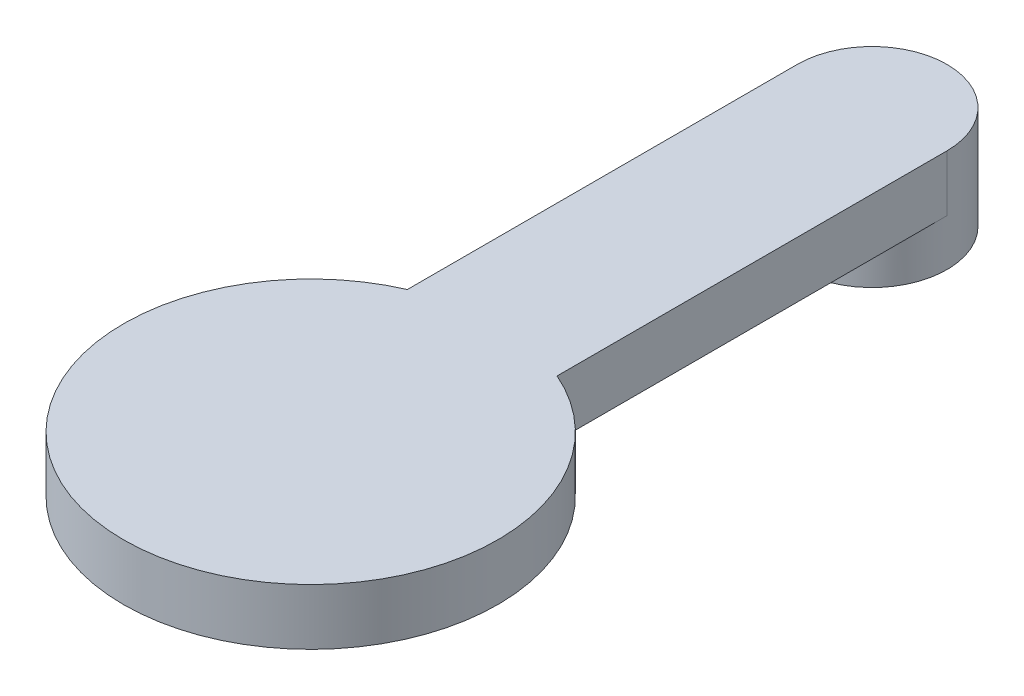
ISO-10303-21;
HEADER;
FILE_DESCRIPTION(('STEP AP214'),'2;1');
FILE_NAME('part.step','',(''),(''),'','','');
FILE_SCHEMA(('AUTOMOTIVE_DESIGN { 1 0 10303 214 1 1 1 1 }'));
ENDSEC;
DATA;
#1=APPLICATION_CONTEXT('core data for automotive mechanical design processes');
#2=APPLICATION_PROTOCOL_DEFINITION('international standard','automotive_design',2000,#1);
#3=PRODUCT_CONTEXT('',#1,'mechanical');
#4=PRODUCT('Part','Part','',(#3));
#5=PRODUCT_RELATED_PRODUCT_CATEGORY('part','',(#4));
#6=PRODUCT_DEFINITION_FORMATION('','',#4);
#7=PRODUCT_DEFINITION_CONTEXT('part definition',#1,'design');
#8=PRODUCT_DEFINITION('design','',#6,#7);
#9=PRODUCT_DEFINITION_SHAPE('','',#8);
#10=(LENGTH_UNIT() NAMED_UNIT(*) SI_UNIT(.MILLI.,.METRE.));
#11=(NAMED_UNIT(*) PLANE_ANGLE_UNIT() SI_UNIT($,.RADIAN.));
#12=(NAMED_UNIT(*) SI_UNIT($,.STERADIAN.) SOLID_ANGLE_UNIT());
#13=UNCERTAINTY_MEASURE_WITH_UNIT(LENGTH_MEASURE(1.E-05),#10,'distance_accuracy_value','');
#14=(GEOMETRIC_REPRESENTATION_CONTEXT(3) GLOBAL_UNCERTAINTY_ASSIGNED_CONTEXT((#13)) GLOBAL_UNIT_ASSIGNED_CONTEXT((#10,
#11,#12)) REPRESENTATION_CONTEXT('',''));
#15=CARTESIAN_POINT('',(0.,0.,0.));
#16=DIRECTION('',(0.,0.,1.));
#17=DIRECTION('',(1.,0.,0.));
#18=AXIS2_PLACEMENT_3D('',#15,#16,#17);
#19=CARTESIAN_POINT('',(0.,0.,0.));
#20=DIRECTION('',(0.,1.,0.));
#21=DIRECTION('',(0.,0.,1.));
#22=AXIS2_PLACEMENT_3D('',#19,#20,#21);
#23=PLANE('',#22);
#24=CARTESIAN_POINT('',(0.,0.,0.));
#25=DIRECTION('',(0.,1.,0.));
#26=DIRECTION('',(0.,0.,1.));
#27=AXIS2_PLACEMENT_3D('',#24,#25,#26);
#28=CIRCLE('',#27,4.);
#29=CARTESIAN_POINT('',(0.,0.,4.));
#30=VERTEX_POINT('',#29);
#31=EDGE_CURVE('E43',#30,#30,#28,.T.);
#32=ORIENTED_EDGE('',*,*,#31,.F.);
#33=EDGE_LOOP('',(#32));
#34=FACE_BOUND('',#33,.T.);
#35=DIRECTION('',(-0.866025403784439,0.,-0.5));
#36=VECTOR('',#35,1.);
#37=CARTESIAN_POINT('',(2.6,0.,-1.50111069989303));
#38=LINE('',#37,#36);
#39=CARTESIAN_POINT('',(2.6,0.,-1.50111069989303));
#40=VERTEX_POINT('',#39);
#41=CARTESIAN_POINT('',(0.,0.,-3.00222139978605));
#42=VERTEX_POINT('',#41);
#43=EDGE_CURVE('E61',#40,#42,#38,.T.);
#44=ORIENTED_EDGE('',*,*,#43,.T.);
#45=DIRECTION('',(-0.866025403784438,0.,0.5));
#46=VECTOR('',#45,1.);
#47=CARTESIAN_POINT('',(0.,0.,-3.00222139978605));
#48=LINE('',#47,#46);
#49=CARTESIAN_POINT('',(-2.6,0.,-1.50111069989303));
#50=VERTEX_POINT('',#49);
#51=EDGE_CURVE('E143',#42,#50,#48,.T.);
#52=ORIENTED_EDGE('',*,*,#51,.T.);
#53=DIRECTION('',(0.,0.,1.));
#54=VECTOR('',#53,1.);
#55=CARTESIAN_POINT('',(-2.6,0.,-1.50111069989303));
#56=LINE('',#55,#54);
#57=CARTESIAN_POINT('',(-2.6,0.,1.50111069989303));
#58=VERTEX_POINT('',#57);
#59=EDGE_CURVE('E178',#50,#58,#56,.T.);
#60=ORIENTED_EDGE('',*,*,#59,.T.);
#61=DIRECTION('',(0.866025403784438,0.,0.5));
#62=VECTOR('',#61,1.);
#63=CARTESIAN_POINT('',(-2.6,0.,1.50111069989303));
#64=LINE('',#63,#62);
#65=CARTESIAN_POINT('',(0.,0.,3.00222139978605));
#66=VERTEX_POINT('',#65);
#67=EDGE_CURVE('E182',#58,#66,#64,.T.);
#68=ORIENTED_EDGE('',*,*,#67,.T.);
#69=DIRECTION('',(0.866025403784439,0.,-0.5));
#70=VECTOR('',#69,1.);
#71=CARTESIAN_POINT('',(0.,0.,3.00222139978605));
#72=LINE('',#71,#70);
#73=CARTESIAN_POINT('',(2.6,0.,1.50111069989303));
#74=VERTEX_POINT('',#73);
#75=EDGE_CURVE('E186',#66,#74,#72,.T.);
#76=ORIENTED_EDGE('',*,*,#75,.T.);
#77=DIRECTION('',(0.,0.,-1.));
#78=VECTOR('',#77,1.);
#79=CARTESIAN_POINT('',(2.6,0.,1.50111069989303));
#80=LINE('',#79,#78);
#81=EDGE_CURVE('E154',#74,#40,#80,.T.);
#82=ORIENTED_EDGE('',*,*,#81,.T.);
#83=EDGE_LOOP('',(#44,#52,#60,#68,#76,#82));
#84=FACE_BOUND('',#83,.T.);
#85=ADVANCED_FACE('F39',(#34,#84),#23,.F.);
#86=CARTESIAN_POINT('',(0.,2.5,0.));
#87=DIRECTION('',(0.,-1.,0.));
#88=DIRECTION('',(0.,0.,-1.));
#89=AXIS2_PLACEMENT_3D('',#86,#87,#88);
#90=CYLINDRICAL_SURFACE('',#89,4.);
#91=CARTESIAN_POINT('',(0.,2.5,0.));
#92=DIRECTION('',(0.,1.,0.));
#93=DIRECTION('',(0.,0.,1.));
#94=AXIS2_PLACEMENT_3D('',#91,#92,#93);
#95=CIRCLE('',#94,4.);
#96=CARTESIAN_POINT('',(-4.,2.5,0.));
#97=VERTEX_POINT('',#96);
#98=CARTESIAN_POINT('',(4.,2.5,0.));
#99=VERTEX_POINT('',#98);
#100=EDGE_CURVE('E11',#97,#99,#95,.T.);
#101=ORIENTED_EDGE('',*,*,#100,.F.);
#102=DIRECTION('',(0.,-1.,0.));
#103=VECTOR('',#102,1.);
#104=CARTESIAN_POINT('',(-4.,5.5,0.));
#105=LINE('',#104,#103);
#106=CARTESIAN_POINT('',(-4.,5.5,0.));
#107=VERTEX_POINT('',#106);
#108=EDGE_CURVE('E121',#107,#97,#105,.T.);
#109=ORIENTED_EDGE('',*,*,#108,.F.);
#110=CARTESIAN_POINT('',(0.,5.5,0.));
#111=DIRECTION('',(0.,1.,0.));
#112=DIRECTION('',(0.,0.,1.));
#113=AXIS2_PLACEMENT_3D('',#110,#111,#112);
#114=CIRCLE('',#113,4.);
#115=CARTESIAN_POINT('',(4.,5.5,0.));
#116=VERTEX_POINT('',#115);
#117=EDGE_CURVE('E128',#116,#107,#114,.T.);
#118=ORIENTED_EDGE('',*,*,#117,.F.);
#119=DIRECTION('',(0.,-1.,0.));
#120=VECTOR('',#119,1.);
#121=CARTESIAN_POINT('',(4.,5.5,0.));
#122=LINE('',#121,#120);
#123=EDGE_CURVE('E364',#116,#99,#122,.T.);
#124=ORIENTED_EDGE('',*,*,#123,.T.);
#125=EDGE_LOOP('',(#101,#109,#118,#124));
#126=FACE_BOUND('',#125,.T.);
#127=ORIENTED_EDGE('',*,*,#31,.T.);
#128=EDGE_LOOP('',(#127));
#129=FACE_BOUND('',#128,.T.);
#130=ADVANCED_FACE('F41',(#126,#129),#90,.T.);
#131=CARTESIAN_POINT('',(2.6,2.5,-1.50111069989303));
#132=DIRECTION('',(-0.5,0.,0.866025403784439));
#133=DIRECTION('',(0.866025403784439,0.,0.5));
#134=AXIS2_PLACEMENT_3D('',#131,#132,#133);
#135=PLANE('',#134);
#136=ORIENTED_EDGE('',*,*,#43,.F.);
#137=DIRECTION('',(0.,-1.,0.));
#138=VECTOR('',#137,1.);
#139=CARTESIAN_POINT('',(2.6,2.5,-1.50111069989303));
#140=LINE('',#139,#138);
#141=CARTESIAN_POINT('',(2.6,2.5,-1.50111069989303));
#142=VERTEX_POINT('',#141);
#143=EDGE_CURVE('E173',#142,#40,#140,.T.);
#144=ORIENTED_EDGE('',*,*,#143,.F.);
#145=DIRECTION('',(-0.866025403784439,0.,-0.5));
#146=VECTOR('',#145,1.);
#147=CARTESIAN_POINT('',(2.6,2.5,-1.50111069989303));
#148=LINE('',#147,#146);
#149=CARTESIAN_POINT('',(0.,2.5,-3.00222139978605));
#150=VERTEX_POINT('',#149);
#151=EDGE_CURVE('E149',#142,#150,#148,.T.);
#152=ORIENTED_EDGE('',*,*,#151,.T.);
#153=DIRECTION('',(0.,-1.,0.));
#154=VECTOR('',#153,1.);
#155=CARTESIAN_POINT('',(0.,2.5,-3.00222139978605));
#156=LINE('',#155,#154);
#157=EDGE_CURVE('E207',#150,#42,#156,.T.);
#158=ORIENTED_EDGE('',*,*,#157,.T.);
#159=EDGE_LOOP('',(#136,#144,#152,#158));
#160=FACE_BOUND('',#159,.T.);
#161=ADVANCED_FACE('F221',(#160),#135,.T.);
#162=CARTESIAN_POINT('',(0.,2.5,-3.00222139978605));
#163=DIRECTION('',(0.5,0.,0.866025403784439));
#164=DIRECTION('',(0.866025403784439,0.,-0.5));
#165=AXIS2_PLACEMENT_3D('',#162,#163,#164);
#166=PLANE('',#165);
#167=ORIENTED_EDGE('',*,*,#51,.F.);
#168=ORIENTED_EDGE('',*,*,#157,.F.);
#169=DIRECTION('',(-0.866025403784438,0.,0.5));
#170=VECTOR('',#169,1.);
#171=CARTESIAN_POINT('',(0.,2.5,-3.00222139978605));
#172=LINE('',#171,#170);
#173=CARTESIAN_POINT('',(-2.6,2.5,-1.50111069989303));
#174=VERTEX_POINT('',#173);
#175=EDGE_CURVE('E153',#150,#174,#172,.T.);
#176=ORIENTED_EDGE('',*,*,#175,.T.);
#177=DIRECTION('',(0.,-1.,0.));
#178=VECTOR('',#177,1.);
#179=CARTESIAN_POINT('',(-2.6,2.5,-1.50111069989303));
#180=LINE('',#179,#178);
#181=EDGE_CURVE('E204',#174,#50,#180,.T.);
#182=ORIENTED_EDGE('',*,*,#181,.T.);
#183=EDGE_LOOP('',(#167,#168,#176,#182));
#184=FACE_BOUND('',#183,.T.);
#185=ADVANCED_FACE('F224',(#184),#166,.T.);
#186=CARTESIAN_POINT('',(-2.6,2.5,-1.50111069989303));
#187=DIRECTION('',(1.,0.,0.));
#188=DIRECTION('',(0.,0.,-1.));
#189=AXIS2_PLACEMENT_3D('',#186,#187,#188);
#190=PLANE('',#189);
#191=ORIENTED_EDGE('',*,*,#59,.F.);
#192=ORIENTED_EDGE('',*,*,#181,.F.);
#193=DIRECTION('',(0.,0.,1.));
#194=VECTOR('',#193,1.);
#195=CARTESIAN_POINT('',(-2.6,2.5,-1.50111069989303));
#196=LINE('',#195,#194);
#197=CARTESIAN_POINT('',(-2.6,2.5,1.50111069989303));
#198=VERTEX_POINT('',#197);
#199=EDGE_CURVE('E158',#174,#198,#196,.T.);
#200=ORIENTED_EDGE('',*,*,#199,.T.);
#201=DIRECTION('',(0.,-1.,0.));
#202=VECTOR('',#201,1.);
#203=CARTESIAN_POINT('',(-2.6,2.5,1.50111069989303));
#204=LINE('',#203,#202);
#205=EDGE_CURVE('E201',#198,#58,#204,.T.);
#206=ORIENTED_EDGE('',*,*,#205,.T.);
#207=EDGE_LOOP('',(#191,#192,#200,#206));
#208=FACE_BOUND('',#207,.T.);
#209=ADVANCED_FACE('F228',(#208),#190,.T.);
#210=CARTESIAN_POINT('',(-2.6,2.5,1.50111069989303));
#211=DIRECTION('',(0.5,0.,-0.866025403784439));
#212=DIRECTION('',(-0.866025403784439,0.,-0.5));
#213=AXIS2_PLACEMENT_3D('',#210,#211,#212);
#214=PLANE('',#213);
#215=ORIENTED_EDGE('',*,*,#67,.F.);
#216=ORIENTED_EDGE('',*,*,#205,.F.);
#217=DIRECTION('',(0.866025403784438,0.,0.5));
#218=VECTOR('',#217,1.);
#219=CARTESIAN_POINT('',(-2.6,2.5,1.50111069989303));
#220=LINE('',#219,#218);
#221=CARTESIAN_POINT('',(0.,2.5,3.00222139978605));
#222=VERTEX_POINT('',#221);
#223=EDGE_CURVE('E162',#198,#222,#220,.T.);
#224=ORIENTED_EDGE('',*,*,#223,.T.);
#225=DIRECTION('',(0.,-1.,0.));
#226=VECTOR('',#225,1.);
#227=CARTESIAN_POINT('',(0.,2.5,3.00222139978605));
#228=LINE('',#227,#226);
#229=EDGE_CURVE('E198',#222,#66,#228,.T.);
#230=ORIENTED_EDGE('',*,*,#229,.T.);
#231=EDGE_LOOP('',(#215,#216,#224,#230));
#232=FACE_BOUND('',#231,.T.);
#233=ADVANCED_FACE('F232',(#232),#214,.T.);
#234=CARTESIAN_POINT('',(0.,2.5,3.00222139978605));
#235=DIRECTION('',(-0.5,0.,-0.866025403784439));
#236=DIRECTION('',(-0.866025403784439,0.,0.5));
#237=AXIS2_PLACEMENT_3D('',#234,#235,#236);
#238=PLANE('',#237);
#239=ORIENTED_EDGE('',*,*,#75,.F.);
#240=ORIENTED_EDGE('',*,*,#229,.F.);
#241=DIRECTION('',(0.866025403784439,0.,-0.5));
#242=VECTOR('',#241,1.);
#243=CARTESIAN_POINT('',(0.,2.5,3.00222139978605));
#244=LINE('',#243,#242);
#245=CARTESIAN_POINT('',(2.6,2.5,1.50111069989303));
#246=VERTEX_POINT('',#245);
#247=EDGE_CURVE('E166',#222,#246,#244,.T.);
#248=ORIENTED_EDGE('',*,*,#247,.T.);
#249=DIRECTION('',(0.,-1.,0.));
#250=VECTOR('',#249,1.);
#251=CARTESIAN_POINT('',(2.6,2.5,1.50111069989303));
#252=LINE('',#251,#250);
#253=EDGE_CURVE('E195',#246,#74,#252,.T.);
#254=ORIENTED_EDGE('',*,*,#253,.T.);
#255=EDGE_LOOP('',(#239,#240,#248,#254));
#256=FACE_BOUND('',#255,.T.);
#257=ADVANCED_FACE('F235',(#256),#238,.T.);
#258=CARTESIAN_POINT('',(2.6,2.5,1.50111069989303));
#259=DIRECTION('',(-1.,0.,0.));
#260=DIRECTION('',(0.,0.,1.));
#261=AXIS2_PLACEMENT_3D('',#258,#259,#260);
#262=PLANE('',#261);
#263=ORIENTED_EDGE('',*,*,#81,.F.);
#264=ORIENTED_EDGE('',*,*,#253,.F.);
#265=DIRECTION('',(0.,0.,-1.));
#266=VECTOR('',#265,1.);
#267=CARTESIAN_POINT('',(2.6,2.5,1.50111069989303));
#268=LINE('',#267,#266);
#269=EDGE_CURVE('E170',#246,#142,#268,.T.);
#270=ORIENTED_EDGE('',*,*,#269,.T.);
#271=ORIENTED_EDGE('',*,*,#143,.T.);
#272=EDGE_LOOP('',(#263,#264,#270,#271));
#273=FACE_BOUND('',#272,.T.);
#274=ADVANCED_FACE('F220',(#273),#262,.T.);
#275=CARTESIAN_POINT('',(0.,2.5,0.));
#276=DIRECTION('',(0.,1.,0.));
#277=DIRECTION('',(0.,0.,1.));
#278=AXIS2_PLACEMENT_3D('',#275,#276,#277);
#279=PLANE('',#278);
#280=ORIENTED_EDGE('',*,*,#175,.F.);
#281=ORIENTED_EDGE('',*,*,#151,.F.);
#282=ORIENTED_EDGE('',*,*,#269,.F.);
#283=ORIENTED_EDGE('',*,*,#247,.F.);
#284=ORIENTED_EDGE('',*,*,#223,.F.);
#285=ORIENTED_EDGE('',*,*,#199,.F.);
#286=EDGE_LOOP('',(#280,#281,#282,#283,#284,#285));
#287=FACE_BOUND('',#286,.T.);
#288=ADVANCED_FACE('F236',(#287),#279,.F.);
#289=DIRECTION('',(0.,0.,1.));
#290=VECTOR('',#289,1.);
#291=CARTESIAN_POINT('',(-4.,2.5,20.8348486100883));
#292=LINE('',#291,#290);
#293=CARTESIAN_POINT('',(-4.,2.5,20.8348486100883));
#294=VERTEX_POINT('',#293);
#295=EDGE_CURVE('E360',#97,#294,#292,.T.);
#296=ORIENTED_EDGE('',*,*,#295,.F.);
#297=ORIENTED_EDGE('',*,*,#100,.T.);
#298=DIRECTION('',(0.,0.,-1.));
#299=VECTOR('',#298,1.);
#300=CARTESIAN_POINT('',(4.,2.5,0.));
#301=LINE('',#300,#299);
#302=CARTESIAN_POINT('',(4.,2.5,20.8348486100883));
#303=VERTEX_POINT('',#302);
#304=EDGE_CURVE('E136',#303,#99,#301,.T.);
#305=ORIENTED_EDGE('',*,*,#304,.F.);
#306=CARTESIAN_POINT('',(0.,2.5,30.));
#307=DIRECTION('',(0.,1.,0.));
#308=DIRECTION('',(0.,0.,1.));
#309=AXIS2_PLACEMENT_3D('',#306,#307,#308);
#310=CIRCLE('',#309,10.);
#311=EDGE_CURVE('E356',#294,#303,#310,.T.);
#312=ORIENTED_EDGE('',*,*,#311,.F.);
#313=EDGE_LOOP('',(#296,#297,#305,#312));
#314=FACE_BOUND('',#313,.T.);
#315=ADVANCED_FACE('F238',(#314),#279,.F.);
#316=CARTESIAN_POINT('',(-4.,5.5,20.8348486100883));
#317=DIRECTION('',(1.,0.,0.));
#318=DIRECTION('',(0.,0.,-1.));
#319=AXIS2_PLACEMENT_3D('',#316,#317,#318);
#320=PLANE('',#319);
#321=ORIENTED_EDGE('',*,*,#295,.T.);
#322=DIRECTION('',(0.,-1.,0.));
#323=VECTOR('',#322,1.);
#324=CARTESIAN_POINT('',(-4.,5.5,20.8348486100883));
#325=LINE('',#324,#323);
#326=CARTESIAN_POINT('',(-4.,5.5,20.8348486100883));
#327=VERTEX_POINT('',#326);
#328=EDGE_CURVE('E123',#327,#294,#325,.T.);
#329=ORIENTED_EDGE('',*,*,#328,.F.);
#330=DIRECTION('',(0.,0.,1.));
#331=VECTOR('',#330,1.);
#332=CARTESIAN_POINT('',(-4.,5.5,20.8348486100883));
#333=LINE('',#332,#331);
#334=EDGE_CURVE('E118',#107,#327,#333,.T.);
#335=ORIENTED_EDGE('',*,*,#334,.F.);
#336=ORIENTED_EDGE('',*,*,#108,.T.);
#337=EDGE_LOOP('',(#321,#329,#335,#336));
#338=FACE_BOUND('',#337,.T.);
#339=ADVANCED_FACE('F120',(#338),#320,.F.);
#340=CARTESIAN_POINT('',(0.,5.5,30.));
#341=DIRECTION('',(0.,-1.,0.));
#342=DIRECTION('',(0.,0.,-1.));
#343=AXIS2_PLACEMENT_3D('',#340,#341,#342);
#344=CYLINDRICAL_SURFACE('',#343,10.);
#345=ORIENTED_EDGE('',*,*,#311,.T.);
#346=DIRECTION('',(0.,-1.,0.));
#347=VECTOR('',#346,1.);
#348=CARTESIAN_POINT('',(4.,5.5,20.8348486100883));
#349=LINE('',#348,#347);
#350=CARTESIAN_POINT('',(4.,5.5,20.8348486100883));
#351=VERTEX_POINT('',#350);
#352=EDGE_CURVE('E145',#351,#303,#349,.T.);
#353=ORIENTED_EDGE('',*,*,#352,.F.);
#354=CARTESIAN_POINT('',(0.,5.5,30.));
#355=DIRECTION('',(0.,1.,0.));
#356=DIRECTION('',(0.,0.,1.));
#357=AXIS2_PLACEMENT_3D('',#354,#355,#356);
#358=CIRCLE('',#357,10.);
#359=EDGE_CURVE('E127',#327,#351,#358,.T.);
#360=ORIENTED_EDGE('',*,*,#359,.F.);
#361=ORIENTED_EDGE('',*,*,#328,.T.);
#362=EDGE_LOOP('',(#345,#353,#360,#361));
#363=FACE_BOUND('',#362,.T.);
#364=ADVANCED_FACE('F251',(#363),#344,.T.);
#365=CARTESIAN_POINT('',(4.,5.5,0.));
#366=DIRECTION('',(-1.,0.,0.));
#367=DIRECTION('',(0.,0.,1.));
#368=AXIS2_PLACEMENT_3D('',#365,#366,#367);
#369=PLANE('',#368);
#370=ORIENTED_EDGE('',*,*,#304,.T.);
#371=ORIENTED_EDGE('',*,*,#123,.F.);
#372=DIRECTION('',(0.,0.,-1.));
#373=VECTOR('',#372,1.);
#374=CARTESIAN_POINT('',(4.,5.5,0.));
#375=LINE('',#374,#373);
#376=EDGE_CURVE('E133',#351,#116,#375,.T.);
#377=ORIENTED_EDGE('',*,*,#376,.F.);
#378=ORIENTED_EDGE('',*,*,#352,.T.);
#379=EDGE_LOOP('',(#370,#371,#377,#378));
#380=FACE_BOUND('',#379,.T.);
#381=ADVANCED_FACE('F248',(#380),#369,.F.);
#382=CARTESIAN_POINT('',(0.,5.5,0.));
#383=DIRECTION('',(0.,1.,0.));
#384=DIRECTION('',(0.,0.,1.));
#385=AXIS2_PLACEMENT_3D('',#382,#383,#384);
#386=PLANE('',#385);
#387=ORIENTED_EDGE('',*,*,#117,.T.);
#388=ORIENTED_EDGE('',*,*,#334,.T.);
#389=ORIENTED_EDGE('',*,*,#359,.T.);
#390=ORIENTED_EDGE('',*,*,#376,.T.);
#391=EDGE_LOOP('',(#387,#388,#389,#390));
#392=FACE_BOUND('',#391,.T.);
#393=ADVANCED_FACE('F131',(#392),#386,.T.);
#394=CLOSED_SHELL('',(#85,#130,#161,#185,#209,#233,#257,#274,#288,#315,#339,#364,#381,#393));
#395=MANIFOLD_SOLID_BREP('B2',#394);
#396=ADVANCED_BREP_SHAPE_REPRESENTATION('',(#18,#395),#14);
#397=SHAPE_DEFINITION_REPRESENTATION(#9,#396);
ENDSEC;
END-ISO-10303-21;
